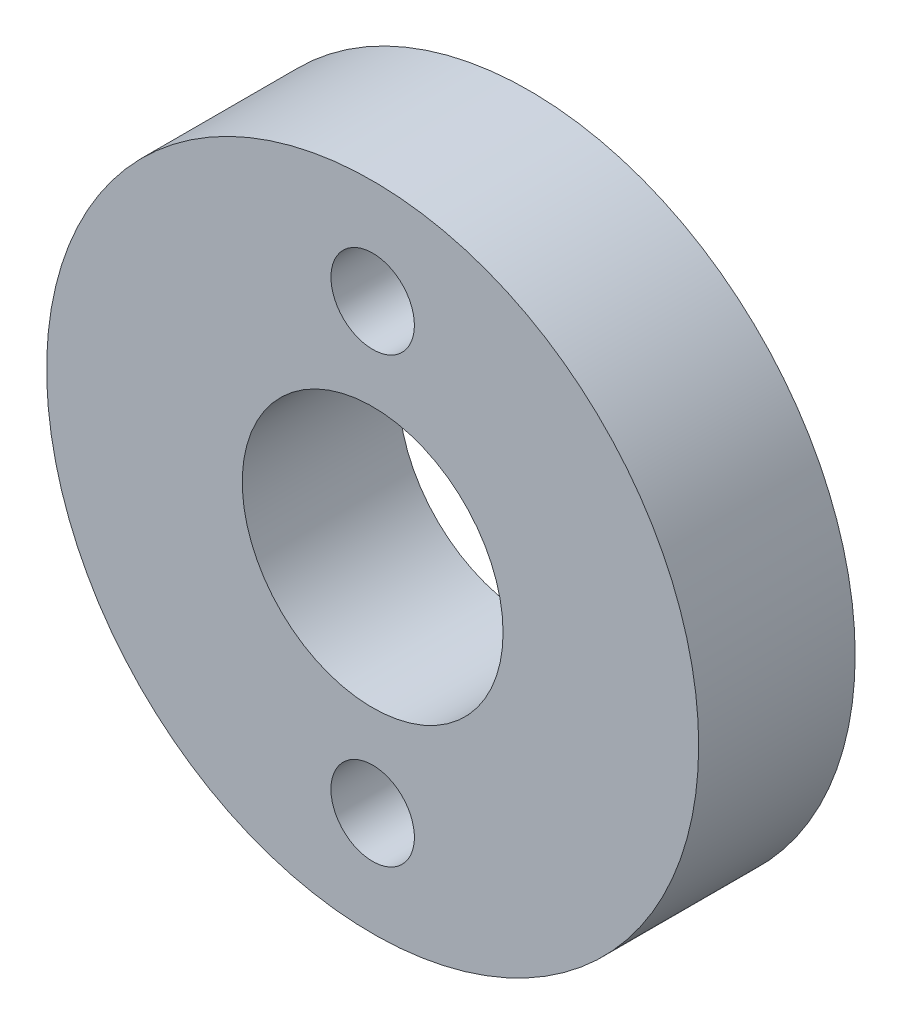
ISO-10303-21;
HEADER;
FILE_DESCRIPTION(('STEP AP214'),'2;1');
FILE_NAME('part.step','',(''),(''),'','','');
FILE_SCHEMA(('AUTOMOTIVE_DESIGN { 1 0 10303 214 1 1 1 1 }'));
ENDSEC;
DATA;
#1=APPLICATION_CONTEXT('core data for automotive mechanical design processes');
#2=APPLICATION_PROTOCOL_DEFINITION('international standard','automotive_design',2000,#1);
#3=PRODUCT_CONTEXT('',#1,'mechanical');
#4=PRODUCT('Part','Part','',(#3));
#5=PRODUCT_RELATED_PRODUCT_CATEGORY('part','',(#4));
#6=PRODUCT_DEFINITION_FORMATION('','',#4);
#7=PRODUCT_DEFINITION_CONTEXT('part definition',#1,'design');
#8=PRODUCT_DEFINITION('design','',#6,#7);
#9=PRODUCT_DEFINITION_SHAPE('','',#8);
#10=(LENGTH_UNIT() NAMED_UNIT(*) SI_UNIT(.MILLI.,.METRE.));
#11=(NAMED_UNIT(*) PLANE_ANGLE_UNIT() SI_UNIT($,.RADIAN.));
#12=(NAMED_UNIT(*) SI_UNIT($,.STERADIAN.) SOLID_ANGLE_UNIT());
#13=UNCERTAINTY_MEASURE_WITH_UNIT(LENGTH_MEASURE(1.E-05),#10,'distance_accuracy_value','');
#14=(GEOMETRIC_REPRESENTATION_CONTEXT(3) GLOBAL_UNCERTAINTY_ASSIGNED_CONTEXT((#13)) GLOBAL_UNIT_ASSIGNED_CONTEXT((#10,
#11,#12)) REPRESENTATION_CONTEXT('',''));
#15=CARTESIAN_POINT('',(0.,0.,0.));
#16=DIRECTION('',(0.,0.,1.));
#17=DIRECTION('',(1.,0.,0.));
#18=AXIS2_PLACEMENT_3D('',#15,#16,#17);
#19=CARTESIAN_POINT('',(0.,0.,3.));
#20=DIRECTION('',(0.,0.,-1.));
#21=DIRECTION('',(-1.,0.,0.));
#22=AXIS2_PLACEMENT_3D('',#19,#20,#21);
#23=CYLINDRICAL_SURFACE('',#22,12.5);
#24=CARTESIAN_POINT('',(0.,0.,3.));
#25=DIRECTION('',(0.,0.,1.));
#26=DIRECTION('',(1.,0.,0.));
#27=AXIS2_PLACEMENT_3D('',#24,#25,#26);
#28=CIRCLE('',#27,12.5);
#29=CARTESIAN_POINT('',(12.5,0.,3.));
#30=VERTEX_POINT('',#29);
#31=EDGE_CURVE('E10',#30,#30,#28,.T.);
#32=ORIENTED_EDGE('',*,*,#31,.F.);
#33=EDGE_LOOP('',(#32));
#34=FACE_BOUND('',#33,.T.);
#35=CARTESIAN_POINT('',(0.,0.,-3.));
#36=DIRECTION('',(0.,0.,1.));
#37=DIRECTION('',(1.,0.,0.));
#38=AXIS2_PLACEMENT_3D('',#35,#36,#37);
#39=CIRCLE('',#38,12.5);
#40=CARTESIAN_POINT('',(12.5,0.,-3.));
#41=VERTEX_POINT('',#40);
#42=EDGE_CURVE('E40',#41,#41,#39,.T.);
#43=ORIENTED_EDGE('',*,*,#42,.T.);
#44=EDGE_LOOP('',(#43));
#45=FACE_BOUND('',#44,.T.);
#46=ADVANCED_FACE('F37',(#34,#45),#23,.T.);
#47=CARTESIAN_POINT('',(0.,0.,3.));
#48=DIRECTION('',(0.,0.,1.));
#49=DIRECTION('',(1.,0.,0.));
#50=AXIS2_PLACEMENT_3D('',#47,#48,#49);
#51=PLANE('',#50);
#52=CARTESIAN_POINT('',(0.,-8.5,3.));
#53=DIRECTION('',(0.,0.,1.));
#54=DIRECTION('',(-1.,0.,0.));
#55=AXIS2_PLACEMENT_3D('',#52,#53,#54);
#56=CIRCLE('',#55,1.6);
#57=CARTESIAN_POINT('',(-1.6,-8.5,3.));
#58=VERTEX_POINT('',#57);
#59=EDGE_CURVE('E67',#58,#58,#56,.T.);
#60=ORIENTED_EDGE('',*,*,#59,.F.);
#61=EDGE_LOOP('',(#60));
#62=FACE_BOUND('',#61,.T.);
#63=CARTESIAN_POINT('',(0.,8.5,3.));
#64=DIRECTION('',(0.,0.,1.));
#65=DIRECTION('',(1.,0.,0.));
#66=AXIS2_PLACEMENT_3D('',#63,#64,#65);
#67=CIRCLE('',#66,1.6);
#68=CARTESIAN_POINT('',(1.6,8.5,3.));
#69=VERTEX_POINT('',#68);
#70=EDGE_CURVE('E59',#69,#69,#67,.T.);
#71=ORIENTED_EDGE('',*,*,#70,.F.);
#72=EDGE_LOOP('',(#71));
#73=FACE_BOUND('',#72,.T.);
#74=CARTESIAN_POINT('',(0.,0.,3.));
#75=DIRECTION('',(0.,0.,1.));
#76=DIRECTION('',(1.,0.,0.));
#77=AXIS2_PLACEMENT_3D('',#74,#75,#76);
#78=CIRCLE('',#77,5.);
#79=CARTESIAN_POINT('',(5.,0.,3.));
#80=VERTEX_POINT('',#79);
#81=EDGE_CURVE('E54',#80,#80,#78,.T.);
#82=ORIENTED_EDGE('',*,*,#81,.F.);
#83=EDGE_LOOP('',(#82));
#84=FACE_BOUND('',#83,.T.);
#85=ORIENTED_EDGE('',*,*,#31,.T.);
#86=EDGE_LOOP('',(#85));
#87=FACE_BOUND('',#86,.T.);
#88=ADVANCED_FACE('F85',(#62,#73,#84,#87),#51,.T.);
#89=CARTESIAN_POINT('',(0.,0.,-3.));
#90=DIRECTION('',(0.,0.,1.));
#91=DIRECTION('',(1.,0.,0.));
#92=AXIS2_PLACEMENT_3D('',#89,#90,#91);
#93=PLANE('',#92);
#94=CARTESIAN_POINT('',(0.,-8.5,-3.));
#95=DIRECTION('',(0.,0.,1.));
#96=DIRECTION('',(-1.,0.,0.));
#97=AXIS2_PLACEMENT_3D('',#94,#95,#96);
#98=CIRCLE('',#97,1.6);
#99=CARTESIAN_POINT('',(-1.6,-8.5,-3.));
#100=VERTEX_POINT('',#99);
#101=EDGE_CURVE('E63',#100,#100,#98,.T.);
#102=ORIENTED_EDGE('',*,*,#101,.T.);
#103=EDGE_LOOP('',(#102));
#104=FACE_BOUND('',#103,.T.);
#105=CARTESIAN_POINT('',(0.,8.5,-3.));
#106=DIRECTION('',(0.,0.,1.));
#107=DIRECTION('',(1.,0.,0.));
#108=AXIS2_PLACEMENT_3D('',#105,#106,#107);
#109=CIRCLE('',#108,1.6);
#110=CARTESIAN_POINT('',(1.6,8.5,-3.));
#111=VERTEX_POINT('',#110);
#112=EDGE_CURVE('E58',#111,#111,#109,.T.);
#113=ORIENTED_EDGE('',*,*,#112,.T.);
#114=EDGE_LOOP('',(#113));
#115=FACE_BOUND('',#114,.T.);
#116=CARTESIAN_POINT('',(0.,0.,-3.));
#117=DIRECTION('',(0.,0.,1.));
#118=DIRECTION('',(1.,0.,0.));
#119=AXIS2_PLACEMENT_3D('',#116,#117,#118);
#120=CIRCLE('',#119,5.);
#121=CARTESIAN_POINT('',(5.,0.,-3.));
#122=VERTEX_POINT('',#121);
#123=EDGE_CURVE('E49',#122,#122,#120,.T.);
#124=ORIENTED_EDGE('',*,*,#123,.T.);
#125=EDGE_LOOP('',(#124));
#126=FACE_BOUND('',#125,.T.);
#127=ORIENTED_EDGE('',*,*,#42,.F.);
#128=EDGE_LOOP('',(#127));
#129=FACE_BOUND('',#128,.T.);
#130=ADVANCED_FACE('F75',(#104,#115,#126,#129),#93,.F.);
#131=CARTESIAN_POINT('',(0.,0.,-3.));
#132=DIRECTION('',(0.,0.,1.));
#133=DIRECTION('',(1.,0.,0.));
#134=AXIS2_PLACEMENT_3D('',#131,#132,#133);
#135=CYLINDRICAL_SURFACE('',#134,5.);
#136=ORIENTED_EDGE('',*,*,#123,.F.);
#137=EDGE_LOOP('',(#136));
#138=FACE_BOUND('',#137,.T.);
#139=ORIENTED_EDGE('',*,*,#81,.T.);
#140=EDGE_LOOP('',(#139));
#141=FACE_BOUND('',#140,.T.);
#142=ADVANCED_FACE('F93',(#138,#141),#135,.F.);
#143=CARTESIAN_POINT('',(0.,8.5,-3.));
#144=DIRECTION('',(0.,0.,1.));
#145=DIRECTION('',(1.,0.,0.));
#146=AXIS2_PLACEMENT_3D('',#143,#144,#145);
#147=CYLINDRICAL_SURFACE('',#146,1.6);
#148=ORIENTED_EDGE('',*,*,#112,.F.);
#149=EDGE_LOOP('',(#148));
#150=FACE_BOUND('',#149,.T.);
#151=ORIENTED_EDGE('',*,*,#70,.T.);
#152=EDGE_LOOP('',(#151));
#153=FACE_BOUND('',#152,.T.);
#154=ADVANCED_FACE('F81',(#150,#153),#147,.F.);
#155=CARTESIAN_POINT('',(0.,-8.5,-3.));
#156=DIRECTION('',(0.,0.,1.));
#157=DIRECTION('',(1.,0.,0.));
#158=AXIS2_PLACEMENT_3D('',#155,#156,#157);
#159=CYLINDRICAL_SURFACE('',#158,1.6);
#160=ORIENTED_EDGE('',*,*,#101,.F.);
#161=EDGE_LOOP('',(#160));
#162=FACE_BOUND('',#161,.T.);
#163=ORIENTED_EDGE('',*,*,#59,.T.);
#164=EDGE_LOOP('',(#163));
#165=FACE_BOUND('',#164,.T.);
#166=ADVANCED_FACE('F78',(#162,#165),#159,.F.);
#167=CLOSED_SHELL('',(#46,#88,#130,#142,#154,#166));
#168=MANIFOLD_SOLID_BREP('B2',#167);
#169=ADVANCED_BREP_SHAPE_REPRESENTATION('',(#18,#168),#14);
#170=SHAPE_DEFINITION_REPRESENTATION(#9,#169);
ENDSEC;
END-ISO-10303-21;
